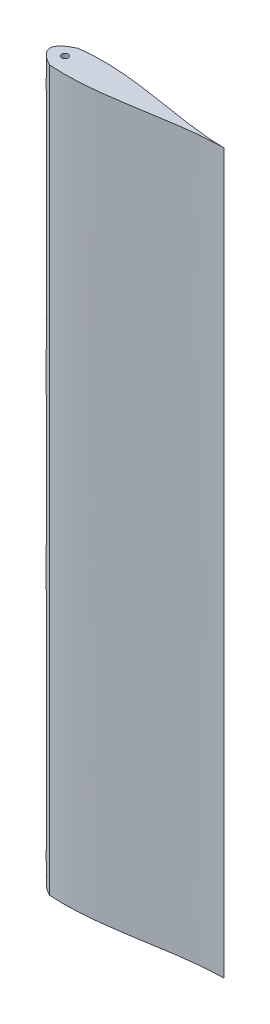
ISO-10303-21;
HEADER;
FILE_DESCRIPTION(('STEP AP214'),'2;1');
FILE_NAME('part.step','',(''),(''),'','','');
FILE_SCHEMA(('AUTOMOTIVE_DESIGN { 1 0 10303 214 1 1 1 1 }'));
ENDSEC;
DATA;
#1=APPLICATION_CONTEXT('core data for automotive mechanical design processes');
#2=APPLICATION_PROTOCOL_DEFINITION('international standard','automotive_design',2000,#1);
#3=PRODUCT_CONTEXT('',#1,'mechanical');
#4=PRODUCT('Part','Part','',(#3));
#5=PRODUCT_RELATED_PRODUCT_CATEGORY('part','',(#4));
#6=PRODUCT_DEFINITION_FORMATION('','',#4);
#7=PRODUCT_DEFINITION_CONTEXT('part definition',#1,'design');
#8=PRODUCT_DEFINITION('design','',#6,#7);
#9=PRODUCT_DEFINITION_SHAPE('','',#8);
#10=(LENGTH_UNIT() NAMED_UNIT(*) SI_UNIT(.MILLI.,.METRE.));
#11=(NAMED_UNIT(*) PLANE_ANGLE_UNIT() SI_UNIT($,.RADIAN.));
#12=(NAMED_UNIT(*) SI_UNIT($,.STERADIAN.) SOLID_ANGLE_UNIT());
#13=UNCERTAINTY_MEASURE_WITH_UNIT(LENGTH_MEASURE(1.E-05),#10,'distance_accuracy_value','');
#14=(GEOMETRIC_REPRESENTATION_CONTEXT(3) GLOBAL_UNCERTAINTY_ASSIGNED_CONTEXT((#13)) GLOBAL_UNIT_ASSIGNED_CONTEXT((#10,
#11,#12)) REPRESENTATION_CONTEXT('',''));
#15=CARTESIAN_POINT('',(0.,0.,0.));
#16=DIRECTION('',(0.,0.,1.));
#17=DIRECTION('',(1.,0.,0.));
#18=AXIS2_PLACEMENT_3D('',#15,#16,#17);
#19=CARTESIAN_POINT('',(-10.5007948782733,100.,-1.85222891563722));
#20=CARTESIAN_POINT('',(-14.506246480952,100.,-0.000403345091255216));
#21=CARTESIAN_POINT('',(-10.5007948782733,100.,2.14777108436278));
#22=B_SPLINE_CURVE_WITH_KNOTS('',2,(#19,#20,#21),.UNSPECIFIED.,.F.,.F.,(3,3),(0.,1.),.UNSPECIFIED.);
#23=DIRECTION('',(0.,-1.,0.));
#24=VECTOR('',#23,1.);
#25=SURFACE_OF_LINEAR_EXTRUSION('',#22,#24);
#26=CARTESIAN_POINT('',(-10.5007948782733,0.,-1.85222891563722));
#27=CARTESIAN_POINT('',(-14.506246480952,0.,-0.000403345091255216));
#28=CARTESIAN_POINT('',(-10.5007948782733,0.,2.14777108436278));
#29=B_SPLINE_CURVE_WITH_KNOTS('',2,(#26,#27,#28),.UNSPECIFIED.,.F.,.F.,(3,3),(0.,1.),.UNSPECIFIED.);
#30=CARTESIAN_POINT('',(-10.5007948782733,0.,-1.85222891563722));
#31=VERTEX_POINT('',#30);
#32=CARTESIAN_POINT('',(-10.5007948782733,0.,2.14777108436278));
#33=VERTEX_POINT('',#32);
#34=EDGE_CURVE('E81',#31,#33,#29,.T.);
#35=ORIENTED_EDGE('',*,*,#34,.T.);
#36=DIRECTION('',(0.,-1.,0.));
#37=VECTOR('',#36,1.);
#38=CARTESIAN_POINT('',(-10.5007948782733,100.,2.14777108436278));
#39=LINE('',#38,#37);
#40=CARTESIAN_POINT('',(-10.5007948782733,100.,2.14777108436278));
#41=VERTEX_POINT('',#40);
#42=EDGE_CURVE('E11',#41,#33,#39,.T.);
#43=ORIENTED_EDGE('',*,*,#42,.F.);
#44=CARTESIAN_POINT('',(-10.5007948782733,100.,-1.85222891563722));
#45=VERTEX_POINT('',#44);
#46=EDGE_CURVE('E77',#45,#41,#22,.T.);
#47=ORIENTED_EDGE('',*,*,#46,.F.);
#48=DIRECTION('',(0.,-1.,0.));
#49=VECTOR('',#48,1.);
#50=CARTESIAN_POINT('',(-10.5007948782733,100.,-1.85222891563722));
#51=LINE('',#50,#49);
#52=EDGE_CURVE('E52',#45,#31,#51,.T.);
#53=ORIENTED_EDGE('',*,*,#52,.T.);
#54=EDGE_LOOP('',(#35,#43,#47,#53));
#55=FACE_BOUND('',#54,.T.);
#56=ADVANCED_FACE('F35',(#55),#25,.F.);
#57=CARTESIAN_POINT('',(-10.5007948782733,100.,2.14777108436278));
#58=CARTESIAN_POINT('',(-2.73674116482957,100.,2.70946861615481));
#59=CARTESIAN_POINT('',(4.78840399934609,100.,-0.112106839681701));
#60=CARTESIAN_POINT('',(12.4992051217267,100.,0.));
#61=B_SPLINE_CURVE_WITH_KNOTS('',3,(#57,#58,#59,#60),.UNSPECIFIED.,.F.,.F.,(4,4),(0.,1.),.UNSPECIFIED.);
#62=DIRECTION('',(0.,-1.,0.));
#63=VECTOR('',#62,1.);
#64=SURFACE_OF_LINEAR_EXTRUSION('',#61,#63);
#65=CARTESIAN_POINT('',(-10.5007948782733,0.,2.14777108436278));
#66=CARTESIAN_POINT('',(-2.73674116482957,0.,2.70946861615481));
#67=CARTESIAN_POINT('',(4.78840399934609,0.,-0.112106839681701));
#68=CARTESIAN_POINT('',(12.4992051217267,0.,0.));
#69=B_SPLINE_CURVE_WITH_KNOTS('',3,(#65,#66,#67,#68),.UNSPECIFIED.,.F.,.F.,(4,4),(0.,1.),.UNSPECIFIED.);
#70=CARTESIAN_POINT('',(11.5903914979069,0.,-9.42587161785696E-10));
#71=VERTEX_POINT('',#70);
#72=EDGE_CURVE('E84',#33,#71,#69,.T.);
#73=ORIENTED_EDGE('',*,*,#72,.T.);
#74=DIRECTION('',(0.,-1.,0.));
#75=VECTOR('',#74,1.);
#76=CARTESIAN_POINT('',(11.5903914979069,100.,-9.42587161785696E-10));
#77=LINE('',#76,#75);
#78=CARTESIAN_POINT('',(11.5903914979069,100.,-9.42587161785696E-10));
#79=VERTEX_POINT('',#78);
#80=EDGE_CURVE('E44',#79,#71,#77,.T.);
#81=ORIENTED_EDGE('',*,*,#80,.F.);
#82=EDGE_CURVE('E70',#41,#79,#61,.T.);
#83=ORIENTED_EDGE('',*,*,#82,.F.);
#84=ORIENTED_EDGE('',*,*,#42,.T.);
#85=EDGE_LOOP('',(#73,#81,#83,#84));
#86=FACE_BOUND('',#85,.T.);
#87=ADVANCED_FACE('F72',(#86),#64,.F.);
#88=CARTESIAN_POINT('',(-10.5007948782733,100.,-1.85222891563722));
#89=CARTESIAN_POINT('',(-2.71894402221051,100.,-2.82788717983477));
#90=CARTESIAN_POINT('',(4.79369312824638,100.,0.116877595647832));
#91=CARTESIAN_POINT('',(12.4992051217267,100.,0.));
#92=B_SPLINE_CURVE_WITH_KNOTS('',3,(#88,#89,#90,#91),.UNSPECIFIED.,.F.,.F.,(4,4),(0.,1.),.UNSPECIFIED.);
#93=DIRECTION('',(0.,-1.,0.));
#94=VECTOR('',#93,1.);
#95=SURFACE_OF_LINEAR_EXTRUSION('',#92,#94);
#96=CARTESIAN_POINT('',(-10.5007948782733,0.,-1.85222891563722));
#97=CARTESIAN_POINT('',(-2.71894402221051,0.,-2.82788717983477));
#98=CARTESIAN_POINT('',(4.79369312824638,0.,0.116877595647832));
#99=CARTESIAN_POINT('',(12.4992051217267,0.,0.));
#100=B_SPLINE_CURVE_WITH_KNOTS('',3,(#96,#97,#98,#99),.UNSPECIFIED.,.F.,.F.,(4,4),(0.,1.),.UNSPECIFIED.);
#101=EDGE_CURVE('E80',#31,#71,#100,.T.);
#102=ORIENTED_EDGE('',*,*,#101,.F.);
#103=ORIENTED_EDGE('',*,*,#52,.F.);
#104=EDGE_CURVE('E76',#45,#79,#92,.T.);
#105=ORIENTED_EDGE('',*,*,#104,.T.);
#106=ORIENTED_EDGE('',*,*,#80,.T.);
#107=EDGE_LOOP('',(#102,#103,#105,#106));
#108=FACE_BOUND('',#107,.T.);
#109=ADVANCED_FACE('F112',(#108),#95,.T.);
#110=CARTESIAN_POINT('',(0.,100.,0.));
#111=DIRECTION('',(0.,1.,0.));
#112=DIRECTION('',(0.,0.,1.));
#113=AXIS2_PLACEMENT_3D('',#110,#111,#112);
#114=PLANE('',#113);
#115=CARTESIAN_POINT('',(-10.5035206796126,100.,0.));
#116=DIRECTION('',(0.,1.,0.));
#117=DIRECTION('',(0.,0.,1.));
#118=AXIS2_PLACEMENT_3D('',#115,#116,#117);
#119=CIRCLE('',#118,0.454289720515952);
#120=CARTESIAN_POINT('',(-10.5035206796126,100.,0.454289720515952));
#121=VERTEX_POINT('',#120);
#122=EDGE_CURVE('E89',#121,#121,#119,.T.);
#123=ORIENTED_EDGE('',*,*,#122,.F.);
#124=EDGE_LOOP('',(#123));
#125=FACE_BOUND('',#124,.T.);
#126=ORIENTED_EDGE('',*,*,#46,.T.);
#127=ORIENTED_EDGE('',*,*,#82,.T.);
#128=ORIENTED_EDGE('',*,*,#104,.F.);
#129=EDGE_LOOP('',(#126,#127,#128));
#130=FACE_BOUND('',#129,.T.);
#131=ADVANCED_FACE('F79',(#125,#130),#114,.T.);
#132=CARTESIAN_POINT('',(0.,0.,0.));
#133=DIRECTION('',(0.,1.,0.));
#134=DIRECTION('',(0.,0.,1.));
#135=AXIS2_PLACEMENT_3D('',#132,#133,#134);
#136=PLANE('',#135);
#137=CARTESIAN_POINT('',(-10.5035206796126,0.,0.));
#138=DIRECTION('',(0.,1.,0.));
#139=DIRECTION('',(0.,0.,1.));
#140=AXIS2_PLACEMENT_3D('',#137,#138,#139);
#141=CIRCLE('',#140,0.454289720515952);
#142=CARTESIAN_POINT('',(-10.5035206796126,0.,0.454289720515952));
#143=VERTEX_POINT('',#142);
#144=EDGE_CURVE('E85',#143,#143,#141,.T.);
#145=ORIENTED_EDGE('',*,*,#144,.T.);
#146=EDGE_LOOP('',(#145));
#147=FACE_BOUND('',#146,.T.);
#148=ORIENTED_EDGE('',*,*,#34,.F.);
#149=ORIENTED_EDGE('',*,*,#101,.T.);
#150=ORIENTED_EDGE('',*,*,#72,.F.);
#151=EDGE_LOOP('',(#148,#149,#150));
#152=FACE_BOUND('',#151,.T.);
#153=ADVANCED_FACE('F119',(#147,#152),#136,.F.);
#154=CARTESIAN_POINT('',(-10.5035206796126,0.,0.));
#155=DIRECTION('',(0.,1.,0.));
#156=DIRECTION('',(0.,0.,1.));
#157=AXIS2_PLACEMENT_3D('',#154,#155,#156);
#158=CYLINDRICAL_SURFACE('',#157,0.454289720515952);
#159=ORIENTED_EDGE('',*,*,#144,.F.);
#160=EDGE_LOOP('',(#159));
#161=FACE_BOUND('',#160,.T.);
#162=ORIENTED_EDGE('',*,*,#122,.T.);
#163=EDGE_LOOP('',(#162));
#164=FACE_BOUND('',#163,.T.);
#165=ADVANCED_FACE('F149',(#161,#164),#158,.F.);
#166=CLOSED_SHELL('',(#56,#87,#109,#131,#153,#165));
#167=MANIFOLD_SOLID_BREP('B2',#166);
#168=ADVANCED_BREP_SHAPE_REPRESENTATION('',(#18,#167),#14);
#169=SHAPE_DEFINITION_REPRESENTATION(#9,#168);
ENDSEC;
END-ISO-10303-21;
